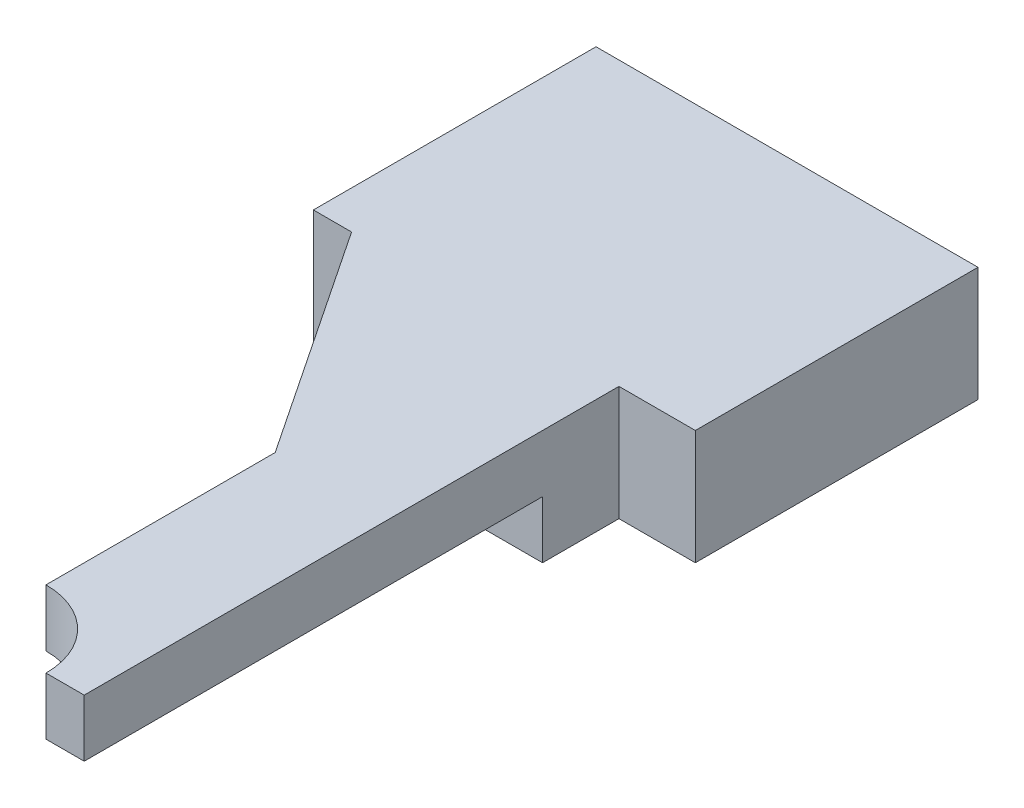
ISO-10303-21;
HEADER;
FILE_DESCRIPTION(('STEP AP214'),'2;1');
FILE_NAME('part.step','',(''),(''),'','','');
FILE_SCHEMA(('AUTOMOTIVE_DESIGN { 1 0 10303 214 1 1 1 1 }'));
ENDSEC;
DATA;
#1=APPLICATION_CONTEXT('core data for automotive mechanical design processes');
#2=APPLICATION_PROTOCOL_DEFINITION('international standard','automotive_design',2000,#1);
#3=PRODUCT_CONTEXT('',#1,'mechanical');
#4=PRODUCT('Part','Part','',(#3));
#5=PRODUCT_RELATED_PRODUCT_CATEGORY('part','',(#4));
#6=PRODUCT_DEFINITION_FORMATION('','',#4);
#7=PRODUCT_DEFINITION_CONTEXT('part definition',#1,'design');
#8=PRODUCT_DEFINITION('design','',#6,#7);
#9=PRODUCT_DEFINITION_SHAPE('','',#8);
#10=(LENGTH_UNIT() NAMED_UNIT(*) SI_UNIT(.MILLI.,.METRE.));
#11=(NAMED_UNIT(*) PLANE_ANGLE_UNIT() SI_UNIT($,.RADIAN.));
#12=(NAMED_UNIT(*) SI_UNIT($,.STERADIAN.) SOLID_ANGLE_UNIT());
#13=UNCERTAINTY_MEASURE_WITH_UNIT(LENGTH_MEASURE(1.E-05),#10,'distance_accuracy_value','');
#14=(GEOMETRIC_REPRESENTATION_CONTEXT(3) GLOBAL_UNCERTAINTY_ASSIGNED_CONTEXT((#13)) GLOBAL_UNIT_ASSIGNED_CONTEXT((#10,
#11,#12)) REPRESENTATION_CONTEXT('',''));
#15=CARTESIAN_POINT('',(0.,0.,0.));
#16=DIRECTION('',(0.,0.,1.));
#17=DIRECTION('',(1.,0.,0.));
#18=AXIS2_PLACEMENT_3D('',#15,#16,#17);
#19=CARTESIAN_POINT('',(0.,7.5,120.));
#20=DIRECTION('',(1.,0.,0.));
#21=DIRECTION('',(0.,0.,-1.));
#22=AXIS2_PLACEMENT_3D('',#19,#20,#21);
#23=PLANE('',#22);
#24=DIRECTION('',(0.,0.,-1.));
#25=VECTOR('',#24,1.);
#26=CARTESIAN_POINT('',(0.,7.5,120.));
#27=LINE('',#26,#25);
#28=CARTESIAN_POINT('',(0.,7.5,110.));
#29=VERTEX_POINT('',#28);
#30=CARTESIAN_POINT('',(0.,7.5,80.));
#31=VERTEX_POINT('',#30);
#32=EDGE_CURVE('E66',#29,#31,#27,.T.);
#33=ORIENTED_EDGE('',*,*,#32,.T.);
#34=DIRECTION('',(0.,1.,0.));
#35=VECTOR('',#34,1.);
#36=CARTESIAN_POINT('',(0.,0.,80.));
#37=LINE('',#36,#35);
#38=CARTESIAN_POINT('',(0.,0.,80.));
#39=VERTEX_POINT('',#38);
#40=EDGE_CURVE('E240',#39,#31,#37,.T.);
#41=ORIENTED_EDGE('',*,*,#40,.F.);
#42=DIRECTION('',(0.,0.,1.));
#43=VECTOR('',#42,1.);
#44=CARTESIAN_POINT('',(0.,0.,60.));
#45=LINE('',#44,#43);
#46=CARTESIAN_POINT('',(0.,0.,110.));
#47=VERTEX_POINT('',#46);
#48=EDGE_CURVE('E191',#39,#47,#45,.T.);
#49=ORIENTED_EDGE('',*,*,#48,.T.);
#50=DIRECTION('',(0.,1.,0.));
#51=VECTOR('',#50,1.);
#52=CARTESIAN_POINT('',(0.,-2.5,110.));
#53=LINE('',#52,#51);
#54=EDGE_CURVE('E202',#47,#29,#53,.T.);
#55=ORIENTED_EDGE('',*,*,#54,.T.);
#56=EDGE_LOOP('',(#33,#41,#49,#55));
#57=FACE_BOUND('',#56,.T.);
#58=ADVANCED_FACE('F43',(#57),#23,.F.);
#59=CARTESIAN_POINT('',(-25.,-7.5,60.));
#60=DIRECTION('',(0.,1.,0.));
#61=DIRECTION('',(0.,0.,1.));
#62=AXIS2_PLACEMENT_3D('',#59,#60,#61);
#63=PLANE('',#62);
#64=DIRECTION('',(0.,0.,-1.));
#65=VECTOR('',#64,1.);
#66=CARTESIAN_POINT('',(-25.,-7.5,60.));
#67=LINE('',#66,#65);
#68=CARTESIAN_POINT('',(-25.,-7.5,50.));
#69=VERTEX_POINT('',#68);
#70=CARTESIAN_POINT('',(-25.,-7.5,13.));
#71=VERTEX_POINT('',#70);
#72=EDGE_CURVE('E167',#69,#71,#67,.T.);
#73=ORIENTED_EDGE('',*,*,#72,.T.);
#74=DIRECTION('',(1.,0.,0.));
#75=VECTOR('',#74,1.);
#76=CARTESIAN_POINT('',(-25.,-7.5,13.));
#77=LINE('',#76,#75);
#78=CARTESIAN_POINT('',(25.,-7.5,13.));
#79=VERTEX_POINT('',#78);
#80=EDGE_CURVE('E59',#71,#79,#77,.T.);
#81=ORIENTED_EDGE('',*,*,#80,.T.);
#82=DIRECTION('',(0.,0.,-1.));
#83=VECTOR('',#82,1.);
#84=CARTESIAN_POINT('',(25.,-7.5,60.));
#85=LINE('',#84,#83);
#86=CARTESIAN_POINT('',(25.,-7.5,50.));
#87=VERTEX_POINT('',#86);
#88=EDGE_CURVE('E153',#87,#79,#85,.T.);
#89=ORIENTED_EDGE('',*,*,#88,.F.);
#90=DIRECTION('',(-1.,0.,0.));
#91=VECTOR('',#90,1.);
#92=CARTESIAN_POINT('',(-25.,-7.5,50.));
#93=LINE('',#92,#91);
#94=CARTESIAN_POINT('',(15.,-7.5,50.));
#95=VERTEX_POINT('',#94);
#96=EDGE_CURVE('E214',#87,#95,#93,.T.);
#97=ORIENTED_EDGE('',*,*,#96,.T.);
#98=DIRECTION('',(0.,0.,1.));
#99=VECTOR('',#98,1.);
#100=CARTESIAN_POINT('',(15.,-7.5,60.));
#101=LINE('',#100,#99);
#102=CARTESIAN_POINT('',(15.,-7.5,60.));
#103=VERTEX_POINT('',#102);
#104=EDGE_CURVE('E222',#95,#103,#101,.T.);
#105=ORIENTED_EDGE('',*,*,#104,.T.);
#106=DIRECTION('',(1.,0.,0.));
#107=VECTOR('',#106,1.);
#108=CARTESIAN_POINT('',(-25.,-7.5,60.));
#109=LINE('',#108,#107);
#110=CARTESIAN_POINT('',(0.,-7.5,60.));
#111=VERTEX_POINT('',#110);
#112=EDGE_CURVE('E175',#111,#103,#109,.T.);
#113=ORIENTED_EDGE('',*,*,#112,.F.);
#114=DIRECTION('',(0.,0.,-1.));
#115=VECTOR('',#114,1.);
#116=CARTESIAN_POINT('',(0.,-7.5,60.));
#117=LINE('',#116,#115);
#118=CARTESIAN_POINT('',(0.,-7.5,50.));
#119=VERTEX_POINT('',#118);
#120=EDGE_CURVE('E226',#111,#119,#117,.T.);
#121=ORIENTED_EDGE('',*,*,#120,.T.);
#122=DIRECTION('',(-1.,0.,0.));
#123=VECTOR('',#122,1.);
#124=CARTESIAN_POINT('',(-25.,-7.5,50.));
#125=LINE('',#124,#123);
#126=EDGE_CURVE('E218',#119,#69,#125,.T.);
#127=ORIENTED_EDGE('',*,*,#126,.T.);
#128=EDGE_LOOP('',(#73,#81,#89,#97,#105,#113,#121,#127));
#129=FACE_BOUND('',#128,.T.);
#130=ADVANCED_FACE('F278',(#129),#63,.F.);
#131=CARTESIAN_POINT('',(25.,7.5,60.));
#132=DIRECTION('',(-1.,0.,0.));
#133=DIRECTION('',(0.,-1.,0.));
#134=AXIS2_PLACEMENT_3D('',#131,#132,#133);
#135=PLANE('',#134);
#136=ORIENTED_EDGE('',*,*,#88,.T.);
#137=DIRECTION('',(0.,1.,0.));
#138=VECTOR('',#137,1.);
#139=CARTESIAN_POINT('',(25.,7.5,13.));
#140=LINE('',#139,#138);
#141=CARTESIAN_POINT('',(25.,7.5,13.));
#142=VERTEX_POINT('',#141);
#143=EDGE_CURVE('E140',#79,#142,#140,.T.);
#144=ORIENTED_EDGE('',*,*,#143,.T.);
#145=DIRECTION('',(0.,0.,-1.));
#146=VECTOR('',#145,1.);
#147=CARTESIAN_POINT('',(25.,7.5,60.));
#148=LINE('',#147,#146);
#149=CARTESIAN_POINT('',(25.,7.5,50.));
#150=VERTEX_POINT('',#149);
#151=EDGE_CURVE('E151',#150,#142,#148,.T.);
#152=ORIENTED_EDGE('',*,*,#151,.F.);
#153=DIRECTION('',(0.,1.,0.));
#154=VECTOR('',#153,1.);
#155=CARTESIAN_POINT('',(25.,-12.5,50.));
#156=LINE('',#155,#154);
#157=EDGE_CURVE('E246',#87,#150,#156,.T.);
#158=ORIENTED_EDGE('',*,*,#157,.F.);
#159=EDGE_LOOP('',(#136,#144,#152,#158));
#160=FACE_BOUND('',#159,.T.);
#161=ADVANCED_FACE('F45',(#160),#135,.F.);
#162=CARTESIAN_POINT('',(-25.,7.5,60.));
#163=DIRECTION('',(0.,-1.,0.));
#164=DIRECTION('',(0.,0.,-1.));
#165=AXIS2_PLACEMENT_3D('',#162,#163,#164);
#166=PLANE('',#165);
#167=ORIENTED_EDGE('',*,*,#151,.T.);
#168=DIRECTION('',(-1.,0.,0.));
#169=VECTOR('',#168,1.);
#170=CARTESIAN_POINT('',(-41.0789243906409,7.5,13.));
#171=LINE('',#170,#169);
#172=CARTESIAN_POINT('',(-25.,7.5,13.));
#173=VERTEX_POINT('',#172);
#174=EDGE_CURVE('E137',#142,#173,#171,.T.);
#175=ORIENTED_EDGE('',*,*,#174,.T.);
#176=DIRECTION('',(0.,0.,-1.));
#177=VECTOR('',#176,1.);
#178=CARTESIAN_POINT('',(-25.,7.5,60.));
#179=LINE('',#178,#177);
#180=CARTESIAN_POINT('',(-25.,7.5,50.));
#181=VERTEX_POINT('',#180);
#182=EDGE_CURVE('E162',#181,#173,#179,.T.);
#183=ORIENTED_EDGE('',*,*,#182,.F.);
#184=DIRECTION('',(-1.,0.,0.));
#185=VECTOR('',#184,1.);
#186=CARTESIAN_POINT('',(-25.,7.5,50.));
#187=LINE('',#186,#185);
#188=CARTESIAN_POINT('',(-20.,7.5,50.));
#189=VERTEX_POINT('',#188);
#190=EDGE_CURVE('E231',#189,#181,#187,.T.);
#191=ORIENTED_EDGE('',*,*,#190,.F.);
#192=DIRECTION('',(0.554700196225229,0.,0.832050294337844));
#193=VECTOR('',#192,1.);
#194=CARTESIAN_POINT('',(0.,7.5,80.));
#195=LINE('',#194,#193);
#196=EDGE_CURVE('E155',#189,#31,#195,.T.);
#197=ORIENTED_EDGE('',*,*,#196,.T.);
#198=ORIENTED_EDGE('',*,*,#32,.F.);
#199=CARTESIAN_POINT('',(0.,7.5,120.));
#200=DIRECTION('',(0.,1.,0.));
#201=DIRECTION('',(0.,0.,-1.));
#202=AXIS2_PLACEMENT_3D('',#199,#200,#201);
#203=CIRCLE('',#202,10.);
#204=CARTESIAN_POINT('',(10.,7.5,120.));
#205=VERTEX_POINT('',#204);
#206=EDGE_CURVE('E209',#205,#29,#203,.T.);
#207=ORIENTED_EDGE('',*,*,#206,.F.);
#208=DIRECTION('',(-1.,0.,0.));
#209=VECTOR('',#208,1.);
#210=CARTESIAN_POINT('',(15.,7.5,120.));
#211=LINE('',#210,#209);
#212=CARTESIAN_POINT('',(15.,7.5,120.));
#213=VERTEX_POINT('',#212);
#214=EDGE_CURVE('E184',#213,#205,#211,.T.);
#215=ORIENTED_EDGE('',*,*,#214,.F.);
#216=DIRECTION('',(0.,0.,-1.));
#217=VECTOR('',#216,1.);
#218=CARTESIAN_POINT('',(15.,7.5,120.));
#219=LINE('',#218,#217);
#220=CARTESIAN_POINT('',(15.,7.5,50.));
#221=VERTEX_POINT('',#220);
#222=EDGE_CURVE('E179',#213,#221,#219,.T.);
#223=ORIENTED_EDGE('',*,*,#222,.T.);
#224=DIRECTION('',(-1.,0.,0.));
#225=VECTOR('',#224,1.);
#226=CARTESIAN_POINT('',(25.,7.5,50.));
#227=LINE('',#226,#225);
#228=EDGE_CURVE('E160',#150,#221,#227,.T.);
#229=ORIENTED_EDGE('',*,*,#228,.F.);
#230=EDGE_LOOP('',(#167,#175,#183,#191,#197,#198,#207,#215,#223,#229));
#231=FACE_BOUND('',#230,.T.);
#232=ADVANCED_FACE('F158',(#231),#166,.F.);
#233=CARTESIAN_POINT('',(-25.,7.5,60.));
#234=DIRECTION('',(1.,0.,0.));
#235=DIRECTION('',(0.,1.,0.));
#236=AXIS2_PLACEMENT_3D('',#233,#234,#235);
#237=PLANE('',#236);
#238=ORIENTED_EDGE('',*,*,#182,.T.);
#239=DIRECTION('',(0.,-1.,0.));
#240=VECTOR('',#239,1.);
#241=CARTESIAN_POINT('',(-25.,7.5,13.));
#242=LINE('',#241,#240);
#243=EDGE_CURVE('E11',#173,#71,#242,.T.);
#244=ORIENTED_EDGE('',*,*,#243,.T.);
#245=ORIENTED_EDGE('',*,*,#72,.F.);
#246=DIRECTION('',(0.,1.,0.));
#247=VECTOR('',#246,1.);
#248=CARTESIAN_POINT('',(-25.,-12.5,50.));
#249=LINE('',#248,#247);
#250=EDGE_CURVE('E235',#69,#181,#249,.T.);
#251=ORIENTED_EDGE('',*,*,#250,.T.);
#252=EDGE_LOOP('',(#238,#244,#245,#251));
#253=FACE_BOUND('',#252,.T.);
#254=ADVANCED_FACE('F281',(#253),#237,.F.);
#255=CARTESIAN_POINT('',(0.,0.,60.));
#256=DIRECTION('',(0.,0.,1.));
#257=DIRECTION('',(1.,0.,0.));
#258=AXIS2_PLACEMENT_3D('',#255,#256,#257);
#259=PLANE('',#258);
#260=DIRECTION('',(0.,1.,0.));
#261=VECTOR('',#260,1.);
#262=CARTESIAN_POINT('',(15.,-12.5,60.));
#263=LINE('',#262,#261);
#264=CARTESIAN_POINT('',(15.,0.,60.));
#265=VERTEX_POINT('',#264);
#266=EDGE_CURVE('E230',#103,#265,#263,.T.);
#267=ORIENTED_EDGE('',*,*,#266,.T.);
#268=DIRECTION('',(-1.,0.,0.));
#269=VECTOR('',#268,1.);
#270=CARTESIAN_POINT('',(15.,0.,60.));
#271=LINE('',#270,#269);
#272=CARTESIAN_POINT('',(0.,0.,60.));
#273=VERTEX_POINT('',#272);
#274=EDGE_CURVE('E195',#265,#273,#271,.T.);
#275=ORIENTED_EDGE('',*,*,#274,.T.);
#276=DIRECTION('',(0.,1.,0.));
#277=VECTOR('',#276,1.);
#278=CARTESIAN_POINT('',(0.,-12.5,60.));
#279=LINE('',#278,#277);
#280=EDGE_CURVE('E234',#111,#273,#279,.T.);
#281=ORIENTED_EDGE('',*,*,#280,.F.);
#282=ORIENTED_EDGE('',*,*,#112,.T.);
#283=EDGE_LOOP('',(#267,#275,#281,#282));
#284=FACE_BOUND('',#283,.T.);
#285=ADVANCED_FACE('F313',(#284),#259,.T.);
#286=CARTESIAN_POINT('',(15.,7.5,120.));
#287=DIRECTION('',(-1.,0.,0.));
#288=DIRECTION('',(0.,0.,1.));
#289=AXIS2_PLACEMENT_3D('',#286,#287,#288);
#290=PLANE('',#289);
#291=DIRECTION('',(0.,1.,0.));
#292=VECTOR('',#291,1.);
#293=CARTESIAN_POINT('',(15.,7.5,120.));
#294=LINE('',#293,#292);
#295=CARTESIAN_POINT('',(15.,0.,120.));
#296=VERTEX_POINT('',#295);
#297=EDGE_CURVE('E188',#296,#213,#294,.T.);
#298=ORIENTED_EDGE('',*,*,#297,.F.);
#299=DIRECTION('',(0.,0.,1.));
#300=VECTOR('',#299,1.);
#301=CARTESIAN_POINT('',(15.,0.,60.));
#302=LINE('',#301,#300);
#303=EDGE_CURVE('E192',#265,#296,#302,.T.);
#304=ORIENTED_EDGE('',*,*,#303,.F.);
#305=ORIENTED_EDGE('',*,*,#266,.F.);
#306=ORIENTED_EDGE('',*,*,#104,.F.);
#307=DIRECTION('',(0.,1.,0.));
#308=VECTOR('',#307,1.);
#309=CARTESIAN_POINT('',(15.,-12.5,50.));
#310=LINE('',#309,#308);
#311=EDGE_CURVE('E249',#95,#221,#310,.T.);
#312=ORIENTED_EDGE('',*,*,#311,.T.);
#313=ORIENTED_EDGE('',*,*,#222,.F.);
#314=EDGE_LOOP('',(#298,#304,#305,#306,#312,#313));
#315=FACE_BOUND('',#314,.T.);
#316=ADVANCED_FACE('F305',(#315),#290,.F.);
#317=ORIENTED_EDGE('',*,*,#280,.T.);
#318=DIRECTION('',(0.,0.,-1.));
#319=VECTOR('',#318,1.);
#320=CARTESIAN_POINT('',(0.,0.,50.));
#321=LINE('',#320,#319);
#322=CARTESIAN_POINT('',(0.,0.,50.));
#323=VERTEX_POINT('',#322);
#324=EDGE_CURVE('E261',#273,#323,#321,.T.);
#325=ORIENTED_EDGE('',*,*,#324,.T.);
#326=DIRECTION('',(0.,1.,0.));
#327=VECTOR('',#326,1.);
#328=CARTESIAN_POINT('',(0.,-12.5,50.));
#329=LINE('',#328,#327);
#330=EDGE_CURVE('E239',#119,#323,#329,.T.);
#331=ORIENTED_EDGE('',*,*,#330,.F.);
#332=ORIENTED_EDGE('',*,*,#120,.F.);
#333=EDGE_LOOP('',(#317,#325,#331,#332));
#334=FACE_BOUND('',#333,.T.);
#335=ADVANCED_FACE('F317',(#334),#23,.F.);
#336=CARTESIAN_POINT('',(0.,0.,120.));
#337=DIRECTION('',(0.,0.,-1.));
#338=DIRECTION('',(-1.,0.,0.));
#339=AXIS2_PLACEMENT_3D('',#336,#337,#338);
#340=PLANE('',#339);
#341=ORIENTED_EDGE('',*,*,#214,.T.);
#342=DIRECTION('',(0.,1.,0.));
#343=VECTOR('',#342,1.);
#344=CARTESIAN_POINT('',(10.,-2.5,120.));
#345=LINE('',#344,#343);
#346=CARTESIAN_POINT('',(10.,0.,120.));
#347=VERTEX_POINT('',#346);
#348=EDGE_CURVE('E206',#347,#205,#345,.T.);
#349=ORIENTED_EDGE('',*,*,#348,.F.);
#350=DIRECTION('',(-1.,0.,0.));
#351=VECTOR('',#350,1.);
#352=CARTESIAN_POINT('',(15.,0.,120.));
#353=LINE('',#352,#351);
#354=EDGE_CURVE('E198',#296,#347,#353,.T.);
#355=ORIENTED_EDGE('',*,*,#354,.F.);
#356=ORIENTED_EDGE('',*,*,#297,.T.);
#357=EDGE_LOOP('',(#341,#349,#355,#356));
#358=FACE_BOUND('',#357,.T.);
#359=ADVANCED_FACE('F300',(#358),#340,.F.);
#360=CARTESIAN_POINT('',(15.,0.,60.));
#361=DIRECTION('',(0.,1.,0.));
#362=DIRECTION('',(-1.,0.,0.));
#363=AXIS2_PLACEMENT_3D('',#360,#361,#362);
#364=PLANE('',#363);
#365=ORIENTED_EDGE('',*,*,#354,.T.);
#366=CARTESIAN_POINT('',(0.,0.,120.));
#367=DIRECTION('',(0.,1.,0.));
#368=DIRECTION('',(-1.,0.,0.));
#369=AXIS2_PLACEMENT_3D('',#366,#367,#368);
#370=CIRCLE('',#369,10.);
#371=EDGE_CURVE('E52',#347,#47,#370,.T.);
#372=ORIENTED_EDGE('',*,*,#371,.T.);
#373=ORIENTED_EDGE('',*,*,#48,.F.);
#374=DIRECTION('',(0.554700196225229,0.,0.832050294337844));
#375=VECTOR('',#374,1.);
#376=CARTESIAN_POINT('',(0.,0.,80.));
#377=LINE('',#376,#375);
#378=CARTESIAN_POINT('',(-20.,0.,50.));
#379=VERTEX_POINT('',#378);
#380=EDGE_CURVE('E270',#379,#39,#377,.T.);
#381=ORIENTED_EDGE('',*,*,#380,.F.);
#382=DIRECTION('',(-1.,0.,0.));
#383=VECTOR('',#382,1.);
#384=CARTESIAN_POINT('',(-20.,0.,50.));
#385=LINE('',#384,#383);
#386=EDGE_CURVE('E267',#323,#379,#385,.T.);
#387=ORIENTED_EDGE('',*,*,#386,.F.);
#388=ORIENTED_EDGE('',*,*,#324,.F.);
#389=ORIENTED_EDGE('',*,*,#274,.F.);
#390=ORIENTED_EDGE('',*,*,#303,.T.);
#391=EDGE_LOOP('',(#365,#372,#373,#381,#387,#388,#389,#390));
#392=FACE_BOUND('',#391,.T.);
#393=ADVANCED_FACE('F293',(#392),#364,.F.);
#394=CARTESIAN_POINT('',(0.,-2.5,120.));
#395=DIRECTION('',(0.,1.,0.));
#396=DIRECTION('',(0.,0.,1.));
#397=AXIS2_PLACEMENT_3D('',#394,#395,#396);
#398=CYLINDRICAL_SURFACE('',#397,10.);
#399=ORIENTED_EDGE('',*,*,#348,.T.);
#400=ORIENTED_EDGE('',*,*,#206,.T.);
#401=ORIENTED_EDGE('',*,*,#54,.F.);
#402=ORIENTED_EDGE('',*,*,#371,.F.);
#403=EDGE_LOOP('',(#399,#400,#401,#402));
#404=FACE_BOUND('',#403,.T.);
#405=ADVANCED_FACE('F297',(#404),#398,.F.);
#406=CARTESIAN_POINT('',(-25.,-12.5,50.));
#407=DIRECTION('',(0.,0.,-1.));
#408=DIRECTION('',(-1.,0.,0.));
#409=AXIS2_PLACEMENT_3D('',#406,#407,#408);
#410=PLANE('',#409);
#411=ORIENTED_EDGE('',*,*,#386,.T.);
#412=DIRECTION('',(0.,1.,0.));
#413=VECTOR('',#412,1.);
#414=CARTESIAN_POINT('',(-20.,0.,50.));
#415=LINE('',#414,#413);
#416=EDGE_CURVE('E257',#379,#189,#415,.T.);
#417=ORIENTED_EDGE('',*,*,#416,.T.);
#418=ORIENTED_EDGE('',*,*,#190,.T.);
#419=ORIENTED_EDGE('',*,*,#250,.F.);
#420=ORIENTED_EDGE('',*,*,#126,.F.);
#421=ORIENTED_EDGE('',*,*,#330,.T.);
#422=EDGE_LOOP('',(#411,#417,#418,#419,#420,#421));
#423=FACE_BOUND('',#422,.T.);
#424=ADVANCED_FACE('F285',(#423),#410,.F.);
#425=CARTESIAN_POINT('',(25.,-12.5,50.));
#426=DIRECTION('',(0.,0.,-1.));
#427=DIRECTION('',(-1.,0.,0.));
#428=AXIS2_PLACEMENT_3D('',#425,#426,#427);
#429=PLANE('',#428);
#430=ORIENTED_EDGE('',*,*,#157,.T.);
#431=ORIENTED_EDGE('',*,*,#228,.T.);
#432=ORIENTED_EDGE('',*,*,#311,.F.);
#433=ORIENTED_EDGE('',*,*,#96,.F.);
#434=EDGE_LOOP('',(#430,#431,#432,#433));
#435=FACE_BOUND('',#434,.T.);
#436=ADVANCED_FACE('F309',(#435),#429,.F.);
#437=CARTESIAN_POINT('',(0.,0.,80.));
#438=DIRECTION('',(-0.832050294337844,0.,0.554700196225229));
#439=DIRECTION('',(0.554700196225229,0.,0.832050294337844));
#440=AXIS2_PLACEMENT_3D('',#437,#438,#439);
#441=PLANE('',#440);
#442=ORIENTED_EDGE('',*,*,#196,.F.);
#443=ORIENTED_EDGE('',*,*,#416,.F.);
#444=ORIENTED_EDGE('',*,*,#380,.T.);
#445=ORIENTED_EDGE('',*,*,#40,.T.);
#446=EDGE_LOOP('',(#442,#443,#444,#445));
#447=FACE_BOUND('',#446,.T.);
#448=ADVANCED_FACE('F289',(#447),#441,.T.);
#449=CARTESIAN_POINT('',(-41.0789243906409,7.5,13.));
#450=DIRECTION('',(0.,0.,1.));
#451=DIRECTION('',(1.,0.,0.));
#452=AXIS2_PLACEMENT_3D('',#449,#450,#451);
#453=PLANE('',#452);
#454=ORIENTED_EDGE('',*,*,#80,.F.);
#455=ORIENTED_EDGE('',*,*,#243,.F.);
#456=ORIENTED_EDGE('',*,*,#174,.F.);
#457=ORIENTED_EDGE('',*,*,#143,.F.);
#458=EDGE_LOOP('',(#454,#455,#456,#457));
#459=FACE_BOUND('',#458,.T.);
#460=ADVANCED_FACE('F139',(#459),#453,.F.);
#461=CLOSED_SHELL('',(#58,#130,#161,#232,#254,#285,#316,#335,#359,#393,#405,#424,#436,#448,#460));
#462=MANIFOLD_SOLID_BREP('B2',#461);
#463=ADVANCED_BREP_SHAPE_REPRESENTATION('',(#18,#462),#14);
#464=SHAPE_DEFINITION_REPRESENTATION(#9,#463);
ENDSEC;
END-ISO-10303-21;
